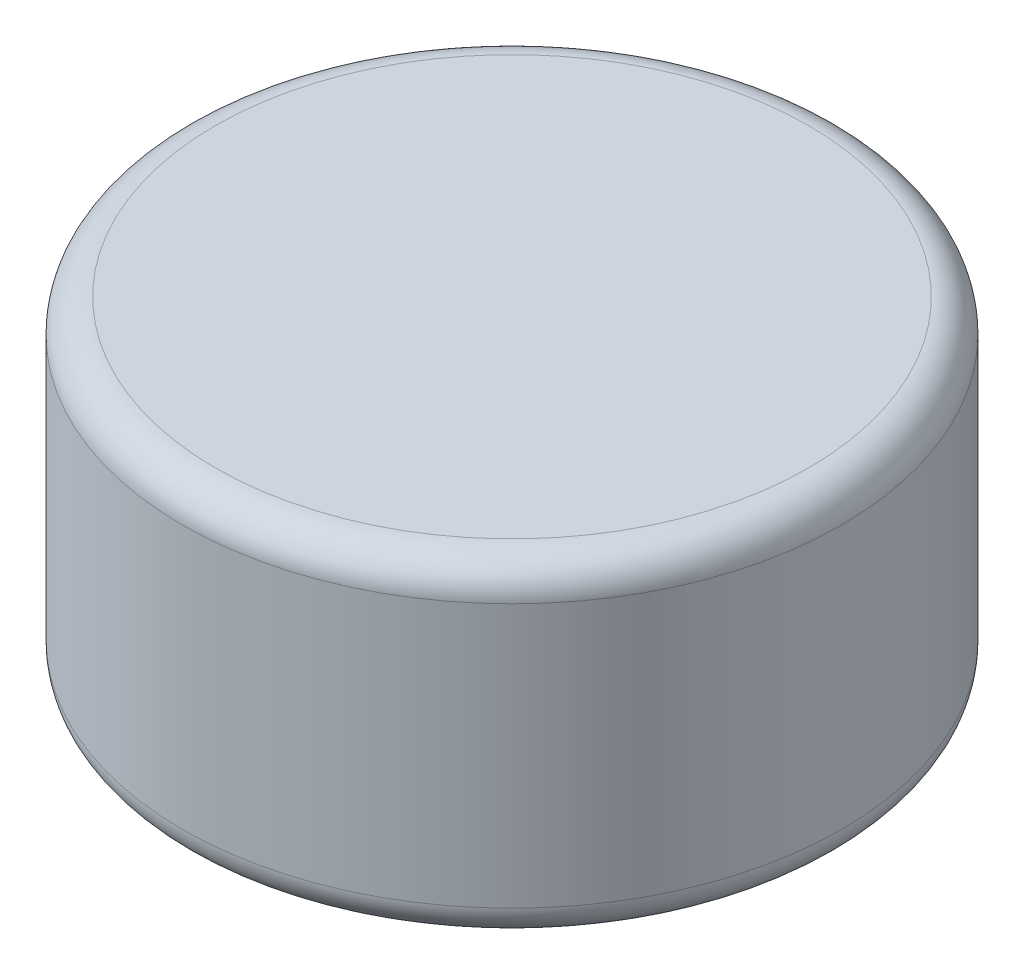
ISO-10303-21;
HEADER;
FILE_DESCRIPTION(('STEP AP214'),'2;1');
FILE_NAME('part.step','',(''),(''),'','','');
FILE_SCHEMA(('AUTOMOTIVE_DESIGN { 1 0 10303 214 1 1 1 1 }'));
ENDSEC;
DATA;
#1=APPLICATION_CONTEXT('core data for automotive mechanical design processes');
#2=APPLICATION_PROTOCOL_DEFINITION('international standard','automotive_design',2000,#1);
#3=PRODUCT_CONTEXT('',#1,'mechanical');
#4=PRODUCT('Part','Part','',(#3));
#5=PRODUCT_RELATED_PRODUCT_CATEGORY('part','',(#4));
#6=PRODUCT_DEFINITION_FORMATION('','',#4);
#7=PRODUCT_DEFINITION_CONTEXT('part definition',#1,'design');
#8=PRODUCT_DEFINITION('design','',#6,#7);
#9=PRODUCT_DEFINITION_SHAPE('','',#8);
#10=(LENGTH_UNIT() NAMED_UNIT(*) SI_UNIT(.MILLI.,.METRE.));
#11=(NAMED_UNIT(*) PLANE_ANGLE_UNIT() SI_UNIT($,.RADIAN.));
#12=(NAMED_UNIT(*) SI_UNIT($,.STERADIAN.) SOLID_ANGLE_UNIT());
#13=UNCERTAINTY_MEASURE_WITH_UNIT(LENGTH_MEASURE(1.E-05),#10,'distance_accuracy_value','');
#14=(GEOMETRIC_REPRESENTATION_CONTEXT(3) GLOBAL_UNCERTAINTY_ASSIGNED_CONTEXT((#13)) GLOBAL_UNIT_ASSIGNED_CONTEXT((#10,
#11,#12)) REPRESENTATION_CONTEXT('',''));
#15=CARTESIAN_POINT('',(0.,0.,0.));
#16=DIRECTION('',(0.,0.,1.));
#17=DIRECTION('',(1.,0.,0.));
#18=AXIS2_PLACEMENT_3D('',#15,#16,#17);
#19=CARTESIAN_POINT('',(0.,2.,0.));
#20=DIRECTION('',(0.,-1.,0.));
#21=DIRECTION('',(0.,0.,-1.));
#22=AXIS2_PLACEMENT_3D('',#19,#20,#21);
#23=CYLINDRICAL_SURFACE('',#22,2.);
#24=CARTESIAN_POINT('',(0.,0.2,0.));
#25=DIRECTION('',(0.,1.,0.));
#26=DIRECTION('',(0.,0.,1.));
#27=AXIS2_PLACEMENT_3D('',#24,#25,#26);
#28=CIRCLE('',#27,2.);
#29=CARTESIAN_POINT('',(0.,0.2,2.));
#30=VERTEX_POINT('',#29);
#31=EDGE_CURVE('E48',#30,#30,#28,.T.);
#32=ORIENTED_EDGE('',*,*,#31,.T.);
#33=EDGE_LOOP('',(#32));
#34=FACE_BOUND('',#33,.T.);
#35=CARTESIAN_POINT('',(0.,1.8,0.));
#36=DIRECTION('',(0.,1.,0.));
#37=DIRECTION('',(0.,0.,1.));
#38=AXIS2_PLACEMENT_3D('',#35,#36,#37);
#39=CIRCLE('',#38,2.);
#40=CARTESIAN_POINT('',(0.,1.8,2.));
#41=VERTEX_POINT('',#40);
#42=EDGE_CURVE('E52',#41,#41,#39,.F.);
#43=ORIENTED_EDGE('',*,*,#42,.T.);
#44=EDGE_LOOP('',(#43));
#45=FACE_BOUND('',#44,.T.);
#46=ADVANCED_FACE('F37',(#34,#45),#23,.T.);
#47=CARTESIAN_POINT('',(0.,2.,0.));
#48=DIRECTION('',(0.,1.,0.));
#49=DIRECTION('',(0.,0.,1.));
#50=AXIS2_PLACEMENT_3D('',#47,#48,#49);
#51=PLANE('',#50);
#52=CARTESIAN_POINT('',(0.,2.,0.));
#53=DIRECTION('',(0.,1.,0.));
#54=DIRECTION('',(0.,0.,1.));
#55=AXIS2_PLACEMENT_3D('',#52,#53,#54);
#56=CIRCLE('',#55,1.8);
#57=CARTESIAN_POINT('',(0.,2.,1.8));
#58=VERTEX_POINT('',#57);
#59=EDGE_CURVE('E10',#58,#58,#56,.T.);
#60=ORIENTED_EDGE('',*,*,#59,.T.);
#61=EDGE_LOOP('',(#60));
#62=FACE_BOUND('',#61,.T.);
#63=ADVANCED_FACE('F68',(#62),#51,.T.);
#64=CARTESIAN_POINT('',(0.,0.,0.));
#65=DIRECTION('',(0.,1.,0.));
#66=DIRECTION('',(0.,0.,1.));
#67=AXIS2_PLACEMENT_3D('',#64,#65,#66);
#68=PLANE('',#67);
#69=CARTESIAN_POINT('',(0.,0.,0.));
#70=DIRECTION('',(0.,1.,0.));
#71=DIRECTION('',(0.,0.,1.));
#72=AXIS2_PLACEMENT_3D('',#69,#70,#71);
#73=CIRCLE('',#72,1.8);
#74=CARTESIAN_POINT('',(0.,0.,1.8));
#75=VERTEX_POINT('',#74);
#76=EDGE_CURVE('E44',#75,#75,#73,.F.);
#77=ORIENTED_EDGE('',*,*,#76,.T.);
#78=EDGE_LOOP('',(#77));
#79=FACE_BOUND('',#78,.T.);
#80=ADVANCED_FACE('F65',(#79),#68,.F.);
#81=CARTESIAN_POINT('',(0.,0.2,0.));
#82=DIRECTION('',(0.,1.,0.));
#83=DIRECTION('',(0.,0.,1.));
#84=AXIS2_PLACEMENT_3D('',#81,#82,#83);
#85=TOROIDAL_SURFACE('',#84,1.8,0.2);
#86=ORIENTED_EDGE('',*,*,#76,.F.);
#87=EDGE_LOOP('',(#86));
#88=FACE_BOUND('',#87,.T.);
#89=ORIENTED_EDGE('',*,*,#31,.F.);
#90=EDGE_LOOP('',(#89));
#91=FACE_BOUND('',#90,.T.);
#92=ADVANCED_FACE('F61',(#88,#91),#85,.T.);
#93=CARTESIAN_POINT('',(0.,1.8,0.));
#94=DIRECTION('',(0.,1.,0.));
#95=DIRECTION('',(0.,0.,1.));
#96=AXIS2_PLACEMENT_3D('',#93,#94,#95);
#97=TOROIDAL_SURFACE('',#96,1.8,0.2);
#98=ORIENTED_EDGE('',*,*,#42,.F.);
#99=EDGE_LOOP('',(#98));
#100=FACE_BOUND('',#99,.T.);
#101=ORIENTED_EDGE('',*,*,#59,.F.);
#102=EDGE_LOOP('',(#101));
#103=FACE_BOUND('',#102,.T.);
#104=ADVANCED_FACE('F39',(#100,#103),#97,.T.);
#105=CLOSED_SHELL('',(#46,#63,#80,#92,#104));
#106=MANIFOLD_SOLID_BREP('B2',#105);
#107=ADVANCED_BREP_SHAPE_REPRESENTATION('',(#18,#106),#14);
#108=SHAPE_DEFINITION_REPRESENTATION(#9,#107);
ENDSEC;
END-ISO-10303-21;
